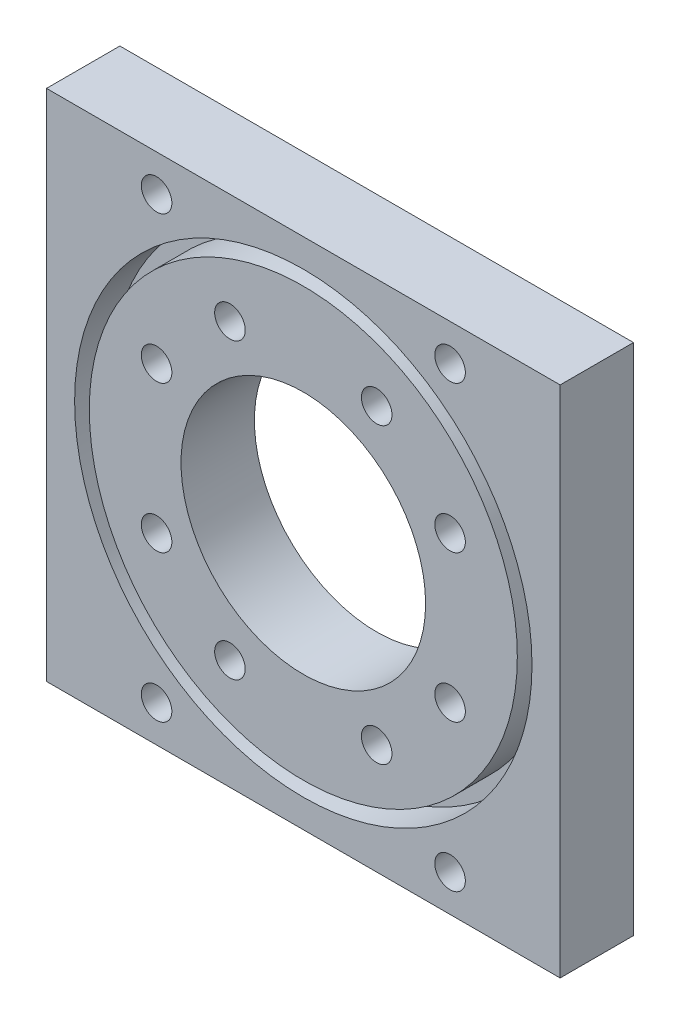
ISO-10303-21;
HEADER;
FILE_DESCRIPTION(('STEP AP214'),'2;1');
FILE_NAME('part.step','',(''),(''),'','','');
FILE_SCHEMA(('AUTOMOTIVE_DESIGN { 1 0 10303 214 1 1 1 1 }'));
ENDSEC;
DATA;
#1=APPLICATION_CONTEXT('core data for automotive mechanical design processes');
#2=APPLICATION_PROTOCOL_DEFINITION('international standard','automotive_design',2000,#1);
#3=PRODUCT_CONTEXT('',#1,'mechanical');
#4=PRODUCT('Part','Part','',(#3));
#5=PRODUCT_RELATED_PRODUCT_CATEGORY('part','',(#4));
#6=PRODUCT_DEFINITION_FORMATION('','',#4);
#7=PRODUCT_DEFINITION_CONTEXT('part definition',#1,'design');
#8=PRODUCT_DEFINITION('design','',#6,#7);
#9=PRODUCT_DEFINITION_SHAPE('','',#8);
#10=(LENGTH_UNIT() NAMED_UNIT(*) SI_UNIT(.MILLI.,.METRE.));
#11=(NAMED_UNIT(*) PLANE_ANGLE_UNIT() SI_UNIT($,.RADIAN.));
#12=(NAMED_UNIT(*) SI_UNIT($,.STERADIAN.) SOLID_ANGLE_UNIT());
#13=UNCERTAINTY_MEASURE_WITH_UNIT(LENGTH_MEASURE(1.E-05),#10,'distance_accuracy_value','');
#14=(GEOMETRIC_REPRESENTATION_CONTEXT(3) GLOBAL_UNCERTAINTY_ASSIGNED_CONTEXT((#13)) GLOBAL_UNIT_ASSIGNED_CONTEXT((#10,
#11,#12)) REPRESENTATION_CONTEXT('',''));
#15=CARTESIAN_POINT('',(0.,0.,0.));
#16=DIRECTION('',(0.,0.,1.));
#17=DIRECTION('',(1.,0.,0.));
#18=AXIS2_PLACEMENT_3D('',#15,#16,#17);
#19=CARTESIAN_POINT('',(0.,0.,6.));
#20=DIRECTION('',(0.,0.,1.));
#21=DIRECTION('',(1.,0.,0.));
#22=AXIS2_PLACEMENT_3D('',#19,#20,#21);
#23=PLANE('',#22);
#24=CARTESIAN_POINT('',(-6.,12.,6.));
#25=DIRECTION('',(0.,0.,1.));
#26=DIRECTION('',(1.,0.,0.));
#27=AXIS2_PLACEMENT_3D('',#24,#25,#26);
#28=CIRCLE('',#27,1.25);
#29=CARTESIAN_POINT('',(-4.75,12.,6.));
#30=VERTEX_POINT('',#29);
#31=EDGE_CURVE('E194',#30,#30,#28,.T.);
#32=ORIENTED_EDGE('',*,*,#31,.F.);
#33=EDGE_LOOP('',(#32));
#34=FACE_BOUND('',#33,.T.);
#35=CARTESIAN_POINT('',(-12.,6.,6.));
#36=DIRECTION('',(0.,0.,1.));
#37=DIRECTION('',(1.,0.,0.));
#38=AXIS2_PLACEMENT_3D('',#35,#36,#37);
#39=CIRCLE('',#38,1.25);
#40=CARTESIAN_POINT('',(-10.75,6.,6.));
#41=VERTEX_POINT('',#40);
#42=EDGE_CURVE('E191',#41,#41,#39,.T.);
#43=ORIENTED_EDGE('',*,*,#42,.F.);
#44=EDGE_LOOP('',(#43));
#45=FACE_BOUND('',#44,.T.);
#46=CARTESIAN_POINT('',(-12.,-6.,6.));
#47=DIRECTION('',(0.,0.,1.));
#48=DIRECTION('',(1.,0.,0.));
#49=AXIS2_PLACEMENT_3D('',#46,#47,#48);
#50=CIRCLE('',#49,1.25);
#51=CARTESIAN_POINT('',(-10.75,-6.,6.));
#52=VERTEX_POINT('',#51);
#53=EDGE_CURVE('E188',#52,#52,#50,.T.);
#54=ORIENTED_EDGE('',*,*,#53,.F.);
#55=EDGE_LOOP('',(#54));
#56=FACE_BOUND('',#55,.T.);
#57=CARTESIAN_POINT('',(6.,12.,6.));
#58=DIRECTION('',(0.,0.,1.));
#59=DIRECTION('',(1.,0.,0.));
#60=AXIS2_PLACEMENT_3D('',#57,#58,#59);
#61=CIRCLE('',#60,1.25);
#62=CARTESIAN_POINT('',(7.25,12.,6.));
#63=VERTEX_POINT('',#62);
#64=EDGE_CURVE('E185',#63,#63,#61,.T.);
#65=ORIENTED_EDGE('',*,*,#64,.F.);
#66=EDGE_LOOP('',(#65));
#67=FACE_BOUND('',#66,.T.);
#68=CARTESIAN_POINT('',(12.,6.,6.));
#69=DIRECTION('',(0.,0.,1.));
#70=DIRECTION('',(1.,0.,0.));
#71=AXIS2_PLACEMENT_3D('',#68,#69,#70);
#72=CIRCLE('',#71,1.25);
#73=CARTESIAN_POINT('',(13.25,6.,6.));
#74=VERTEX_POINT('',#73);
#75=EDGE_CURVE('E182',#74,#74,#72,.T.);
#76=ORIENTED_EDGE('',*,*,#75,.F.);
#77=EDGE_LOOP('',(#76));
#78=FACE_BOUND('',#77,.T.);
#79=CARTESIAN_POINT('',(12.,-6.,6.));
#80=DIRECTION('',(0.,0.,1.));
#81=DIRECTION('',(1.,0.,0.));
#82=AXIS2_PLACEMENT_3D('',#79,#80,#81);
#83=CIRCLE('',#82,1.25);
#84=CARTESIAN_POINT('',(13.25,-6.,6.));
#85=VERTEX_POINT('',#84);
#86=EDGE_CURVE('E179',#85,#85,#83,.T.);
#87=ORIENTED_EDGE('',*,*,#86,.F.);
#88=EDGE_LOOP('',(#87));
#89=FACE_BOUND('',#88,.T.);
#90=CARTESIAN_POINT('',(0.,0.,6.));
#91=DIRECTION('',(0.,0.,1.));
#92=DIRECTION('',(1.,0.,0.));
#93=AXIS2_PLACEMENT_3D('',#90,#91,#92);
#94=CIRCLE('',#93,10.);
#95=CARTESIAN_POINT('',(10.,0.,6.));
#96=VERTEX_POINT('',#95);
#97=EDGE_CURVE('E159',#96,#96,#94,.T.);
#98=ORIENTED_EDGE('',*,*,#97,.F.);
#99=EDGE_LOOP('',(#98));
#100=FACE_BOUND('',#99,.T.);
#101=CARTESIAN_POINT('',(-6.,-12.,6.));
#102=DIRECTION('',(0.,0.,1.));
#103=DIRECTION('',(1.,0.,0.));
#104=AXIS2_PLACEMENT_3D('',#101,#102,#103);
#105=CIRCLE('',#104,1.25);
#106=CARTESIAN_POINT('',(-4.75,-12.,6.));
#107=VERTEX_POINT('',#106);
#108=EDGE_CURVE('E154',#107,#107,#105,.T.);
#109=ORIENTED_EDGE('',*,*,#108,.F.);
#110=EDGE_LOOP('',(#109));
#111=FACE_BOUND('',#110,.T.);
#112=CARTESIAN_POINT('',(6.,-12.,6.));
#113=DIRECTION('',(0.,0.,1.));
#114=DIRECTION('',(1.,0.,0.));
#115=AXIS2_PLACEMENT_3D('',#112,#113,#114);
#116=CIRCLE('',#115,1.25);
#117=CARTESIAN_POINT('',(7.25,-12.,6.));
#118=VERTEX_POINT('',#117);
#119=EDGE_CURVE('E150',#118,#118,#116,.T.);
#120=ORIENTED_EDGE('',*,*,#119,.F.);
#121=EDGE_LOOP('',(#120));
#122=FACE_BOUND('',#121,.T.);
#123=CARTESIAN_POINT('',(0.,0.,6.));
#124=DIRECTION('',(0.,0.,1.));
#125=DIRECTION('',(1.,0.,0.));
#126=AXIS2_PLACEMENT_3D('',#123,#124,#125);
#127=CIRCLE('',#126,17.5);
#128=CARTESIAN_POINT('',(17.5,0.,6.));
#129=VERTEX_POINT('',#128);
#130=EDGE_CURVE('E222',#129,#129,#127,.T.);
#131=ORIENTED_EDGE('',*,*,#130,.T.);
#132=EDGE_LOOP('',(#131));
#133=FACE_BOUND('',#132,.T.);
#134=ADVANCED_FACE('F38',(#34,#45,#56,#67,#78,#89,#100,#111,#122,#133),#23,.T.);
#135=CARTESIAN_POINT('',(0.,-21.,6.));
#136=DIRECTION('',(0.,1.,0.));
#137=DIRECTION('',(0.,0.,1.));
#138=AXIS2_PLACEMENT_3D('',#135,#136,#137);
#139=PLANE('',#138);
#140=DIRECTION('',(1.,0.,0.));
#141=VECTOR('',#140,1.);
#142=CARTESIAN_POINT('',(0.,-21.,0.));
#143=LINE('',#142,#141);
#144=CARTESIAN_POINT('',(-21.,-21.,0.));
#145=VERTEX_POINT('',#144);
#146=CARTESIAN_POINT('',(21.,-21.,0.));
#147=VERTEX_POINT('',#146);
#148=EDGE_CURVE('E142',#145,#147,#143,.T.);
#149=ORIENTED_EDGE('',*,*,#148,.T.);
#150=DIRECTION('',(0.,0.,-1.));
#151=VECTOR('',#150,1.);
#152=CARTESIAN_POINT('',(21.,-21.,6.));
#153=LINE('',#152,#151);
#154=CARTESIAN_POINT('',(21.,-21.,6.));
#155=VERTEX_POINT('',#154);
#156=EDGE_CURVE('E11',#155,#147,#153,.T.);
#157=ORIENTED_EDGE('',*,*,#156,.F.);
#158=DIRECTION('',(1.,0.,0.));
#159=VECTOR('',#158,1.);
#160=CARTESIAN_POINT('',(0.,-21.,6.));
#161=LINE('',#160,#159);
#162=CARTESIAN_POINT('',(-21.,-21.,6.));
#163=VERTEX_POINT('',#162);
#164=EDGE_CURVE('E88',#163,#155,#161,.T.);
#165=ORIENTED_EDGE('',*,*,#164,.F.);
#166=DIRECTION('',(0.,0.,-1.));
#167=VECTOR('',#166,1.);
#168=CARTESIAN_POINT('',(-21.,-21.,6.));
#169=LINE('',#168,#167);
#170=EDGE_CURVE('E55',#163,#145,#169,.T.);
#171=ORIENTED_EDGE('',*,*,#170,.T.);
#172=EDGE_LOOP('',(#149,#157,#165,#171));
#173=FACE_BOUND('',#172,.T.);
#174=ADVANCED_FACE('F203',(#173),#139,.F.);
#175=CARTESIAN_POINT('',(21.,0.,6.));
#176=DIRECTION('',(-1.,0.,0.));
#177=DIRECTION('',(0.,0.,1.));
#178=AXIS2_PLACEMENT_3D('',#175,#176,#177);
#179=PLANE('',#178);
#180=DIRECTION('',(0.,1.,0.));
#181=VECTOR('',#180,1.);
#182=CARTESIAN_POINT('',(21.,0.,0.));
#183=LINE('',#182,#181);
#184=CARTESIAN_POINT('',(21.,21.,0.));
#185=VERTEX_POINT('',#184);
#186=EDGE_CURVE('E93',#147,#185,#183,.T.);
#187=ORIENTED_EDGE('',*,*,#186,.T.);
#188=DIRECTION('',(0.,0.,-1.));
#189=VECTOR('',#188,1.);
#190=CARTESIAN_POINT('',(21.,21.,6.));
#191=LINE('',#190,#189);
#192=CARTESIAN_POINT('',(21.,21.,6.));
#193=VERTEX_POINT('',#192);
#194=EDGE_CURVE('E47',#193,#185,#191,.T.);
#195=ORIENTED_EDGE('',*,*,#194,.F.);
#196=DIRECTION('',(0.,1.,0.));
#197=VECTOR('',#196,1.);
#198=CARTESIAN_POINT('',(21.,0.,6.));
#199=LINE('',#198,#197);
#200=EDGE_CURVE('E80',#155,#193,#199,.T.);
#201=ORIENTED_EDGE('',*,*,#200,.F.);
#202=ORIENTED_EDGE('',*,*,#156,.T.);
#203=EDGE_LOOP('',(#187,#195,#201,#202));
#204=FACE_BOUND('',#203,.T.);
#205=ADVANCED_FACE('F92',(#204),#179,.F.);
#206=CARTESIAN_POINT('',(0.,21.,6.));
#207=DIRECTION('',(0.,1.,0.));
#208=DIRECTION('',(0.,0.,1.));
#209=AXIS2_PLACEMENT_3D('',#206,#207,#208);
#210=PLANE('',#209);
#211=DIRECTION('',(1.,0.,0.));
#212=VECTOR('',#211,1.);
#213=CARTESIAN_POINT('',(0.,21.,0.));
#214=LINE('',#213,#212);
#215=CARTESIAN_POINT('',(-21.,21.,0.));
#216=VERTEX_POINT('',#215);
#217=EDGE_CURVE('E145',#216,#185,#214,.T.);
#218=ORIENTED_EDGE('',*,*,#217,.F.);
#219=DIRECTION('',(0.,0.,-1.));
#220=VECTOR('',#219,1.);
#221=CARTESIAN_POINT('',(-21.,21.,6.));
#222=LINE('',#221,#220);
#223=CARTESIAN_POINT('',(-21.,21.,6.));
#224=VERTEX_POINT('',#223);
#225=EDGE_CURVE('E69',#224,#216,#222,.T.);
#226=ORIENTED_EDGE('',*,*,#225,.F.);
#227=DIRECTION('',(1.,0.,0.));
#228=VECTOR('',#227,1.);
#229=CARTESIAN_POINT('',(0.,21.,6.));
#230=LINE('',#229,#228);
#231=EDGE_CURVE('E87',#224,#193,#230,.T.);
#232=ORIENTED_EDGE('',*,*,#231,.T.);
#233=ORIENTED_EDGE('',*,*,#194,.T.);
#234=EDGE_LOOP('',(#218,#226,#232,#233));
#235=FACE_BOUND('',#234,.T.);
#236=ADVANCED_FACE('F96',(#235),#210,.T.);
#237=CARTESIAN_POINT('',(-6.,12.,6.));
#238=DIRECTION('',(0.,0.,-1.));
#239=DIRECTION('',(-1.,0.,0.));
#240=AXIS2_PLACEMENT_3D('',#237,#238,#239);
#241=CYLINDRICAL_SURFACE('',#240,1.25);
#242=ORIENTED_EDGE('',*,*,#31,.T.);
#243=EDGE_LOOP('',(#242));
#244=FACE_BOUND('',#243,.T.);
#245=CARTESIAN_POINT('',(-6.,12.,0.));
#246=DIRECTION('',(0.,0.,1.));
#247=DIRECTION('',(1.,0.,0.));
#248=AXIS2_PLACEMENT_3D('',#245,#246,#247);
#249=CIRCLE('',#248,1.25);
#250=CARTESIAN_POINT('',(-4.75,12.,0.));
#251=VERTEX_POINT('',#250);
#252=EDGE_CURVE('E139',#251,#251,#249,.T.);
#253=ORIENTED_EDGE('',*,*,#252,.F.);
#254=EDGE_LOOP('',(#253));
#255=FACE_BOUND('',#254,.T.);
#256=ADVANCED_FACE('F198',(#244,#255),#241,.F.);
#257=CARTESIAN_POINT('',(-12.,6.,6.));
#258=DIRECTION('',(0.,0.,-1.));
#259=DIRECTION('',(-1.,0.,0.));
#260=AXIS2_PLACEMENT_3D('',#257,#258,#259);
#261=CYLINDRICAL_SURFACE('',#260,1.25);
#262=ORIENTED_EDGE('',*,*,#42,.T.);
#263=EDGE_LOOP('',(#262));
#264=FACE_BOUND('',#263,.T.);
#265=CARTESIAN_POINT('',(-12.,6.,0.));
#266=DIRECTION('',(0.,0.,1.));
#267=DIRECTION('',(1.,0.,0.));
#268=AXIS2_PLACEMENT_3D('',#265,#266,#267);
#269=CIRCLE('',#268,1.25);
#270=CARTESIAN_POINT('',(-10.75,6.,0.));
#271=VERTEX_POINT('',#270);
#272=EDGE_CURVE('E136',#271,#271,#269,.T.);
#273=ORIENTED_EDGE('',*,*,#272,.F.);
#274=EDGE_LOOP('',(#273));
#275=FACE_BOUND('',#274,.T.);
#276=ADVANCED_FACE('F286',(#264,#275),#261,.F.);
#277=CARTESIAN_POINT('',(-12.,-6.,6.));
#278=DIRECTION('',(0.,0.,-1.));
#279=DIRECTION('',(-1.,0.,0.));
#280=AXIS2_PLACEMENT_3D('',#277,#278,#279);
#281=CYLINDRICAL_SURFACE('',#280,1.25);
#282=ORIENTED_EDGE('',*,*,#53,.T.);
#283=EDGE_LOOP('',(#282));
#284=FACE_BOUND('',#283,.T.);
#285=CARTESIAN_POINT('',(-12.,-6.,0.));
#286=DIRECTION('',(0.,0.,1.));
#287=DIRECTION('',(1.,0.,0.));
#288=AXIS2_PLACEMENT_3D('',#285,#286,#287);
#289=CIRCLE('',#288,1.25);
#290=CARTESIAN_POINT('',(-10.75,-6.,0.));
#291=VERTEX_POINT('',#290);
#292=EDGE_CURVE('E133',#291,#291,#289,.T.);
#293=ORIENTED_EDGE('',*,*,#292,.F.);
#294=EDGE_LOOP('',(#293));
#295=FACE_BOUND('',#294,.T.);
#296=ADVANCED_FACE('F289',(#284,#295),#281,.F.);
#297=CARTESIAN_POINT('',(6.,12.,6.));
#298=DIRECTION('',(0.,0.,-1.));
#299=DIRECTION('',(-1.,0.,0.));
#300=AXIS2_PLACEMENT_3D('',#297,#298,#299);
#301=CYLINDRICAL_SURFACE('',#300,1.25);
#302=ORIENTED_EDGE('',*,*,#64,.T.);
#303=EDGE_LOOP('',(#302));
#304=FACE_BOUND('',#303,.T.);
#305=CARTESIAN_POINT('',(6.,12.,0.));
#306=DIRECTION('',(0.,0.,1.));
#307=DIRECTION('',(1.,0.,0.));
#308=AXIS2_PLACEMENT_3D('',#305,#306,#307);
#309=CIRCLE('',#308,1.25);
#310=CARTESIAN_POINT('',(7.25,12.,0.));
#311=VERTEX_POINT('',#310);
#312=EDGE_CURVE('E130',#311,#311,#309,.T.);
#313=ORIENTED_EDGE('',*,*,#312,.F.);
#314=EDGE_LOOP('',(#313));
#315=FACE_BOUND('',#314,.T.);
#316=ADVANCED_FACE('F293',(#304,#315),#301,.F.);
#317=CARTESIAN_POINT('',(12.,6.,6.));
#318=DIRECTION('',(0.,0.,-1.));
#319=DIRECTION('',(-1.,0.,0.));
#320=AXIS2_PLACEMENT_3D('',#317,#318,#319);
#321=CYLINDRICAL_SURFACE('',#320,1.25);
#322=ORIENTED_EDGE('',*,*,#75,.T.);
#323=EDGE_LOOP('',(#322));
#324=FACE_BOUND('',#323,.T.);
#325=CARTESIAN_POINT('',(12.,6.,0.));
#326=DIRECTION('',(0.,0.,1.));
#327=DIRECTION('',(1.,0.,0.));
#328=AXIS2_PLACEMENT_3D('',#325,#326,#327);
#329=CIRCLE('',#328,1.25);
#330=CARTESIAN_POINT('',(13.25,6.,0.));
#331=VERTEX_POINT('',#330);
#332=EDGE_CURVE('E127',#331,#331,#329,.T.);
#333=ORIENTED_EDGE('',*,*,#332,.F.);
#334=EDGE_LOOP('',(#333));
#335=FACE_BOUND('',#334,.T.);
#336=ADVANCED_FACE('F297',(#324,#335),#321,.F.);
#337=CARTESIAN_POINT('',(12.,-6.,6.));
#338=DIRECTION('',(0.,0.,-1.));
#339=DIRECTION('',(-1.,0.,0.));
#340=AXIS2_PLACEMENT_3D('',#337,#338,#339);
#341=CYLINDRICAL_SURFACE('',#340,1.25);
#342=ORIENTED_EDGE('',*,*,#86,.T.);
#343=EDGE_LOOP('',(#342));
#344=FACE_BOUND('',#343,.T.);
#345=CARTESIAN_POINT('',(12.,-6.,0.));
#346=DIRECTION('',(0.,0.,1.));
#347=DIRECTION('',(1.,0.,0.));
#348=AXIS2_PLACEMENT_3D('',#345,#346,#347);
#349=CIRCLE('',#348,1.25);
#350=CARTESIAN_POINT('',(13.25,-6.,0.));
#351=VERTEX_POINT('',#350);
#352=EDGE_CURVE('E124',#351,#351,#349,.T.);
#353=ORIENTED_EDGE('',*,*,#352,.F.);
#354=EDGE_LOOP('',(#353));
#355=FACE_BOUND('',#354,.T.);
#356=ADVANCED_FACE('F252',(#344,#355),#341,.F.);
#357=CARTESIAN_POINT('',(-12.,18.,6.));
#358=DIRECTION('',(0.,0.,-1.));
#359=DIRECTION('',(-1.,0.,0.));
#360=AXIS2_PLACEMENT_3D('',#357,#358,#359);
#361=CYLINDRICAL_SURFACE('',#360,1.25);
#362=CARTESIAN_POINT('',(-12.,18.,6.));
#363=DIRECTION('',(0.,0.,1.));
#364=DIRECTION('',(1.,0.,0.));
#365=AXIS2_PLACEMENT_3D('',#362,#363,#364);
#366=CIRCLE('',#365,1.25);
#367=CARTESIAN_POINT('',(-10.75,18.,6.));
#368=VERTEX_POINT('',#367);
#369=EDGE_CURVE('E176',#368,#368,#366,.T.);
#370=ORIENTED_EDGE('',*,*,#369,.T.);
#371=EDGE_LOOP('',(#370));
#372=FACE_BOUND('',#371,.T.);
#373=CARTESIAN_POINT('',(-12.,18.,0.));
#374=DIRECTION('',(0.,0.,1.));
#375=DIRECTION('',(1.,0.,0.));
#376=AXIS2_PLACEMENT_3D('',#373,#374,#375);
#377=CIRCLE('',#376,1.25);
#378=CARTESIAN_POINT('',(-10.75,18.,0.));
#379=VERTEX_POINT('',#378);
#380=EDGE_CURVE('E121',#379,#379,#377,.T.);
#381=ORIENTED_EDGE('',*,*,#380,.F.);
#382=EDGE_LOOP('',(#381));
#383=FACE_BOUND('',#382,.T.);
#384=ADVANCED_FACE('F248',(#372,#383),#361,.F.);
#385=CARTESIAN_POINT('',(12.,18.,6.));
#386=DIRECTION('',(0.,0.,-1.));
#387=DIRECTION('',(-1.,0.,0.));
#388=AXIS2_PLACEMENT_3D('',#385,#386,#387);
#389=CYLINDRICAL_SURFACE('',#388,1.25);
#390=CARTESIAN_POINT('',(12.,18.,6.));
#391=DIRECTION('',(0.,0.,1.));
#392=DIRECTION('',(1.,0.,0.));
#393=AXIS2_PLACEMENT_3D('',#390,#391,#392);
#394=CIRCLE('',#393,1.25);
#395=CARTESIAN_POINT('',(13.25,18.,6.));
#396=VERTEX_POINT('',#395);
#397=EDGE_CURVE('E173',#396,#396,#394,.T.);
#398=ORIENTED_EDGE('',*,*,#397,.T.);
#399=EDGE_LOOP('',(#398));
#400=FACE_BOUND('',#399,.T.);
#401=CARTESIAN_POINT('',(12.,18.,0.));
#402=DIRECTION('',(0.,0.,1.));
#403=DIRECTION('',(1.,0.,0.));
#404=AXIS2_PLACEMENT_3D('',#401,#402,#403);
#405=CIRCLE('',#404,1.25);
#406=CARTESIAN_POINT('',(13.25,18.,0.));
#407=VERTEX_POINT('',#406);
#408=EDGE_CURVE('E118',#407,#407,#405,.T.);
#409=ORIENTED_EDGE('',*,*,#408,.F.);
#410=EDGE_LOOP('',(#409));
#411=FACE_BOUND('',#410,.T.);
#412=ADVANCED_FACE('F251',(#400,#411),#389,.F.);
#413=CARTESIAN_POINT('',(-12.,-18.,6.));
#414=DIRECTION('',(0.,0.,-1.));
#415=DIRECTION('',(-1.,0.,0.));
#416=AXIS2_PLACEMENT_3D('',#413,#414,#415);
#417=CYLINDRICAL_SURFACE('',#416,1.25);
#418=CARTESIAN_POINT('',(-12.,-18.,6.));
#419=DIRECTION('',(0.,0.,1.));
#420=DIRECTION('',(1.,0.,0.));
#421=AXIS2_PLACEMENT_3D('',#418,#419,#420);
#422=CIRCLE('',#421,1.25);
#423=CARTESIAN_POINT('',(-10.75,-18.,6.));
#424=VERTEX_POINT('',#423);
#425=EDGE_CURVE('E170',#424,#424,#422,.T.);
#426=ORIENTED_EDGE('',*,*,#425,.T.);
#427=EDGE_LOOP('',(#426));
#428=FACE_BOUND('',#427,.T.);
#429=CARTESIAN_POINT('',(-12.,-18.,0.));
#430=DIRECTION('',(0.,0.,1.));
#431=DIRECTION('',(1.,0.,0.));
#432=AXIS2_PLACEMENT_3D('',#429,#430,#431);
#433=CIRCLE('',#432,1.25);
#434=CARTESIAN_POINT('',(-10.75,-18.,0.));
#435=VERTEX_POINT('',#434);
#436=EDGE_CURVE('E115',#435,#435,#433,.T.);
#437=ORIENTED_EDGE('',*,*,#436,.F.);
#438=EDGE_LOOP('',(#437));
#439=FACE_BOUND('',#438,.T.);
#440=ADVANCED_FACE('F307',(#428,#439),#417,.F.);
#441=CARTESIAN_POINT('',(12.,-18.,6.));
#442=DIRECTION('',(0.,0.,-1.));
#443=DIRECTION('',(-1.,0.,0.));
#444=AXIS2_PLACEMENT_3D('',#441,#442,#443);
#445=CYLINDRICAL_SURFACE('',#444,1.25);
#446=CARTESIAN_POINT('',(12.,-18.,6.));
#447=DIRECTION('',(0.,0.,1.));
#448=DIRECTION('',(1.,0.,0.));
#449=AXIS2_PLACEMENT_3D('',#446,#447,#448);
#450=CIRCLE('',#449,1.25);
#451=CARTESIAN_POINT('',(13.25,-18.,6.));
#452=VERTEX_POINT('',#451);
#453=EDGE_CURVE('E167',#452,#452,#450,.T.);
#454=ORIENTED_EDGE('',*,*,#453,.T.);
#455=EDGE_LOOP('',(#454));
#456=FACE_BOUND('',#455,.T.);
#457=CARTESIAN_POINT('',(12.,-18.,0.));
#458=DIRECTION('',(0.,0.,1.));
#459=DIRECTION('',(1.,0.,0.));
#460=AXIS2_PLACEMENT_3D('',#457,#458,#459);
#461=CIRCLE('',#460,1.25);
#462=CARTESIAN_POINT('',(13.25,-18.,0.));
#463=VERTEX_POINT('',#462);
#464=EDGE_CURVE('E112',#463,#463,#461,.T.);
#465=ORIENTED_EDGE('',*,*,#464,.F.);
#466=EDGE_LOOP('',(#465));
#467=FACE_BOUND('',#466,.T.);
#468=ADVANCED_FACE('F311',(#456,#467),#445,.F.);
#469=CARTESIAN_POINT('',(0.,0.,6.));
#470=DIRECTION('',(0.,0.,-1.));
#471=DIRECTION('',(-1.,0.,0.));
#472=AXIS2_PLACEMENT_3D('',#469,#470,#471);
#473=CYLINDRICAL_SURFACE('',#472,10.);
#474=ORIENTED_EDGE('',*,*,#97,.T.);
#475=EDGE_LOOP('',(#474));
#476=FACE_BOUND('',#475,.T.);
#477=CARTESIAN_POINT('',(0.,0.,0.));
#478=DIRECTION('',(0.,0.,1.));
#479=DIRECTION('',(1.,0.,0.));
#480=AXIS2_PLACEMENT_3D('',#477,#478,#479);
#481=CIRCLE('',#480,10.);
#482=CARTESIAN_POINT('',(10.,0.,0.));
#483=VERTEX_POINT('',#482);
#484=EDGE_CURVE('E109',#483,#483,#481,.T.);
#485=ORIENTED_EDGE('',*,*,#484,.F.);
#486=EDGE_LOOP('',(#485));
#487=FACE_BOUND('',#486,.T.);
#488=ADVANCED_FACE('F315',(#476,#487),#473,.F.);
#489=CARTESIAN_POINT('',(-6.,-12.,6.));
#490=DIRECTION('',(0.,0.,-1.));
#491=DIRECTION('',(-1.,0.,0.));
#492=AXIS2_PLACEMENT_3D('',#489,#490,#491);
#493=CYLINDRICAL_SURFACE('',#492,1.25);
#494=ORIENTED_EDGE('',*,*,#108,.T.);
#495=EDGE_LOOP('',(#494));
#496=FACE_BOUND('',#495,.T.);
#497=CARTESIAN_POINT('',(-6.,-12.,0.));
#498=DIRECTION('',(0.,0.,1.));
#499=DIRECTION('',(1.,0.,0.));
#500=AXIS2_PLACEMENT_3D('',#497,#498,#499);
#501=CIRCLE('',#500,1.25);
#502=CARTESIAN_POINT('',(-4.75,-12.,0.));
#503=VERTEX_POINT('',#502);
#504=EDGE_CURVE('E105',#503,#503,#501,.T.);
#505=ORIENTED_EDGE('',*,*,#504,.F.);
#506=EDGE_LOOP('',(#505));
#507=FACE_BOUND('',#506,.T.);
#508=ADVANCED_FACE('F276',(#496,#507),#493,.F.);
#509=CARTESIAN_POINT('',(6.,-12.,6.));
#510=DIRECTION('',(0.,0.,-1.));
#511=DIRECTION('',(-1.,0.,0.));
#512=AXIS2_PLACEMENT_3D('',#509,#510,#511);
#513=CYLINDRICAL_SURFACE('',#512,1.25);
#514=ORIENTED_EDGE('',*,*,#119,.T.);
#515=EDGE_LOOP('',(#514));
#516=FACE_BOUND('',#515,.T.);
#517=CARTESIAN_POINT('',(6.,-12.,0.));
#518=DIRECTION('',(0.,0.,1.));
#519=DIRECTION('',(1.,0.,0.));
#520=AXIS2_PLACEMENT_3D('',#517,#518,#519);
#521=CIRCLE('',#520,1.25);
#522=CARTESIAN_POINT('',(7.25,-12.,0.));
#523=VERTEX_POINT('',#522);
#524=EDGE_CURVE('E102',#523,#523,#521,.T.);
#525=ORIENTED_EDGE('',*,*,#524,.F.);
#526=EDGE_LOOP('',(#525));
#527=FACE_BOUND('',#526,.T.);
#528=ADVANCED_FACE('F40',(#516,#527),#513,.F.);
#529=CARTESIAN_POINT('',(-21.,0.,6.));
#530=DIRECTION('',(-1.,0.,0.));
#531=DIRECTION('',(0.,0.,1.));
#532=AXIS2_PLACEMENT_3D('',#529,#530,#531);
#533=PLANE('',#532);
#534=DIRECTION('',(0.,1.,0.));
#535=VECTOR('',#534,1.);
#536=CARTESIAN_POINT('',(-21.,0.,0.));
#537=LINE('',#536,#535);
#538=EDGE_CURVE('E147',#145,#216,#537,.T.);
#539=ORIENTED_EDGE('',*,*,#538,.F.);
#540=ORIENTED_EDGE('',*,*,#170,.F.);
#541=DIRECTION('',(0.,1.,0.));
#542=VECTOR('',#541,1.);
#543=CARTESIAN_POINT('',(-21.,0.,6.));
#544=LINE('',#543,#542);
#545=EDGE_CURVE('E97',#163,#224,#544,.T.);
#546=ORIENTED_EDGE('',*,*,#545,.T.);
#547=ORIENTED_EDGE('',*,*,#225,.T.);
#548=EDGE_LOOP('',(#539,#540,#546,#547));
#549=FACE_BOUND('',#548,.T.);
#550=ADVANCED_FACE('F239',(#549),#533,.T.);
#551=CARTESIAN_POINT('',(0.,0.,6.));
#552=DIRECTION('',(0.,0.,1.));
#553=DIRECTION('',(1.,0.,0.));
#554=AXIS2_PLACEMENT_3D('',#551,#552,#553);
#555=CIRCLE('',#554,18.7);
#556=CARTESIAN_POINT('',(18.7,0.,6.));
#557=VERTEX_POINT('',#556);
#558=EDGE_CURVE('E162',#557,#557,#555,.T.);
#559=ORIENTED_EDGE('',*,*,#558,.F.);
#560=EDGE_LOOP('',(#559));
#561=FACE_BOUND('',#560,.T.);
#562=ORIENTED_EDGE('',*,*,#453,.F.);
#563=EDGE_LOOP('',(#562));
#564=FACE_BOUND('',#563,.T.);
#565=ORIENTED_EDGE('',*,*,#425,.F.);
#566=EDGE_LOOP('',(#565));
#567=FACE_BOUND('',#566,.T.);
#568=ORIENTED_EDGE('',*,*,#397,.F.);
#569=EDGE_LOOP('',(#568));
#570=FACE_BOUND('',#569,.T.);
#571=ORIENTED_EDGE('',*,*,#369,.F.);
#572=EDGE_LOOP('',(#571));
#573=FACE_BOUND('',#572,.T.);
#574=ORIENTED_EDGE('',*,*,#164,.T.);
#575=ORIENTED_EDGE('',*,*,#200,.T.);
#576=ORIENTED_EDGE('',*,*,#231,.F.);
#577=ORIENTED_EDGE('',*,*,#545,.F.);
#578=EDGE_LOOP('',(#574,#575,#576,#577));
#579=FACE_BOUND('',#578,.T.);
#580=ADVANCED_FACE('F84',(#561,#564,#567,#570,#573,#579),#23,.T.);
#581=CARTESIAN_POINT('',(0.,0.,0.));
#582=DIRECTION('',(0.,0.,1.));
#583=DIRECTION('',(1.,0.,0.));
#584=AXIS2_PLACEMENT_3D('',#581,#582,#583);
#585=PLANE('',#584);
#586=ORIENTED_EDGE('',*,*,#524,.T.);
#587=EDGE_LOOP('',(#586));
#588=FACE_BOUND('',#587,.T.);
#589=ORIENTED_EDGE('',*,*,#504,.T.);
#590=EDGE_LOOP('',(#589));
#591=FACE_BOUND('',#590,.T.);
#592=ORIENTED_EDGE('',*,*,#484,.T.);
#593=EDGE_LOOP('',(#592));
#594=FACE_BOUND('',#593,.T.);
#595=ORIENTED_EDGE('',*,*,#464,.T.);
#596=EDGE_LOOP('',(#595));
#597=FACE_BOUND('',#596,.T.);
#598=ORIENTED_EDGE('',*,*,#436,.T.);
#599=EDGE_LOOP('',(#598));
#600=FACE_BOUND('',#599,.T.);
#601=ORIENTED_EDGE('',*,*,#408,.T.);
#602=EDGE_LOOP('',(#601));
#603=FACE_BOUND('',#602,.T.);
#604=ORIENTED_EDGE('',*,*,#380,.T.);
#605=EDGE_LOOP('',(#604));
#606=FACE_BOUND('',#605,.T.);
#607=ORIENTED_EDGE('',*,*,#352,.T.);
#608=EDGE_LOOP('',(#607));
#609=FACE_BOUND('',#608,.T.);
#610=ORIENTED_EDGE('',*,*,#332,.T.);
#611=EDGE_LOOP('',(#610));
#612=FACE_BOUND('',#611,.T.);
#613=ORIENTED_EDGE('',*,*,#312,.T.);
#614=EDGE_LOOP('',(#613));
#615=FACE_BOUND('',#614,.T.);
#616=ORIENTED_EDGE('',*,*,#292,.T.);
#617=EDGE_LOOP('',(#616));
#618=FACE_BOUND('',#617,.T.);
#619=ORIENTED_EDGE('',*,*,#272,.T.);
#620=EDGE_LOOP('',(#619));
#621=FACE_BOUND('',#620,.T.);
#622=ORIENTED_EDGE('',*,*,#252,.T.);
#623=EDGE_LOOP('',(#622));
#624=FACE_BOUND('',#623,.T.);
#625=ORIENTED_EDGE('',*,*,#148,.F.);
#626=ORIENTED_EDGE('',*,*,#538,.T.);
#627=ORIENTED_EDGE('',*,*,#217,.T.);
#628=ORIENTED_EDGE('',*,*,#186,.F.);
#629=EDGE_LOOP('',(#625,#626,#627,#628));
#630=FACE_BOUND('',#629,.T.);
#631=ADVANCED_FACE('F238',(#588,#591,#594,#597,#600,#603,#606,#609,#612,#615,#618,#621,#624,
#630),#585,.F.);
#632=CARTESIAN_POINT('',(0.,0.,3.));
#633=DIRECTION('',(0.,0.,1.));
#634=DIRECTION('',(1.,0.,0.));
#635=AXIS2_PLACEMENT_3D('',#632,#633,#634);
#636=CYLINDRICAL_SURFACE('',#635,18.7);
#637=CARTESIAN_POINT('',(0.,0.,3.));
#638=DIRECTION('',(0.,0.,1.));
#639=DIRECTION('',(1.,0.,0.));
#640=AXIS2_PLACEMENT_3D('',#637,#638,#639);
#641=CIRCLE('',#640,18.7);
#642=CARTESIAN_POINT('',(18.7,0.,3.));
#643=VERTEX_POINT('',#642);
#644=EDGE_CURVE('E106',#643,#643,#641,.T.);
#645=ORIENTED_EDGE('',*,*,#644,.F.);
#646=EDGE_LOOP('',(#645));
#647=FACE_BOUND('',#646,.T.);
#648=ORIENTED_EDGE('',*,*,#558,.T.);
#649=EDGE_LOOP('',(#648));
#650=FACE_BOUND('',#649,.T.);
#651=ADVANCED_FACE('F234',(#647,#650),#636,.F.);
#652=CARTESIAN_POINT('',(0.,0.,3.));
#653=DIRECTION('',(0.,0.,1.));
#654=DIRECTION('',(1.,0.,0.));
#655=AXIS2_PLACEMENT_3D('',#652,#653,#654);
#656=PLANE('',#655);
#657=CARTESIAN_POINT('',(0.,0.,3.));
#658=DIRECTION('',(0.,0.,1.));
#659=DIRECTION('',(1.,0.,0.));
#660=AXIS2_PLACEMENT_3D('',#657,#658,#659);
#661=CIRCLE('',#660,17.5);
#662=CARTESIAN_POINT('',(17.5,0.,3.));
#663=VERTEX_POINT('',#662);
#664=EDGE_CURVE('E224',#663,#663,#661,.T.);
#665=ORIENTED_EDGE('',*,*,#664,.F.);
#666=EDGE_LOOP('',(#665));
#667=FACE_BOUND('',#666,.T.);
#668=ORIENTED_EDGE('',*,*,#644,.T.);
#669=EDGE_LOOP('',(#668));
#670=FACE_BOUND('',#669,.T.);
#671=ADVANCED_FACE('F378',(#667,#670),#656,.T.);
#672=CARTESIAN_POINT('',(0.,0.,3.));
#673=DIRECTION('',(0.,0.,1.));
#674=DIRECTION('',(1.,0.,0.));
#675=AXIS2_PLACEMENT_3D('',#672,#673,#674);
#676=CYLINDRICAL_SURFACE('',#675,17.5);
#677=ORIENTED_EDGE('',*,*,#664,.T.);
#678=EDGE_LOOP('',(#677));
#679=FACE_BOUND('',#678,.T.);
#680=ORIENTED_EDGE('',*,*,#130,.F.);
#681=EDGE_LOOP('',(#680));
#682=FACE_BOUND('',#681,.T.);
#683=ADVANCED_FACE('F388',(#679,#682),#676,.T.);
#684=CLOSED_SHELL('',(#134,#174,#205,#236,#256,#276,#296,#316,#336,#356,#384,#412,#440,#468,
#488,#508,#528,#550,#580,#631,#651,#671,#683));
#685=MANIFOLD_SOLID_BREP('B2',#684);
#686=ADVANCED_BREP_SHAPE_REPRESENTATION('',(#18,#685),#14);
#687=SHAPE_DEFINITION_REPRESENTATION(#9,#686);
ENDSEC;
END-ISO-10303-21;
